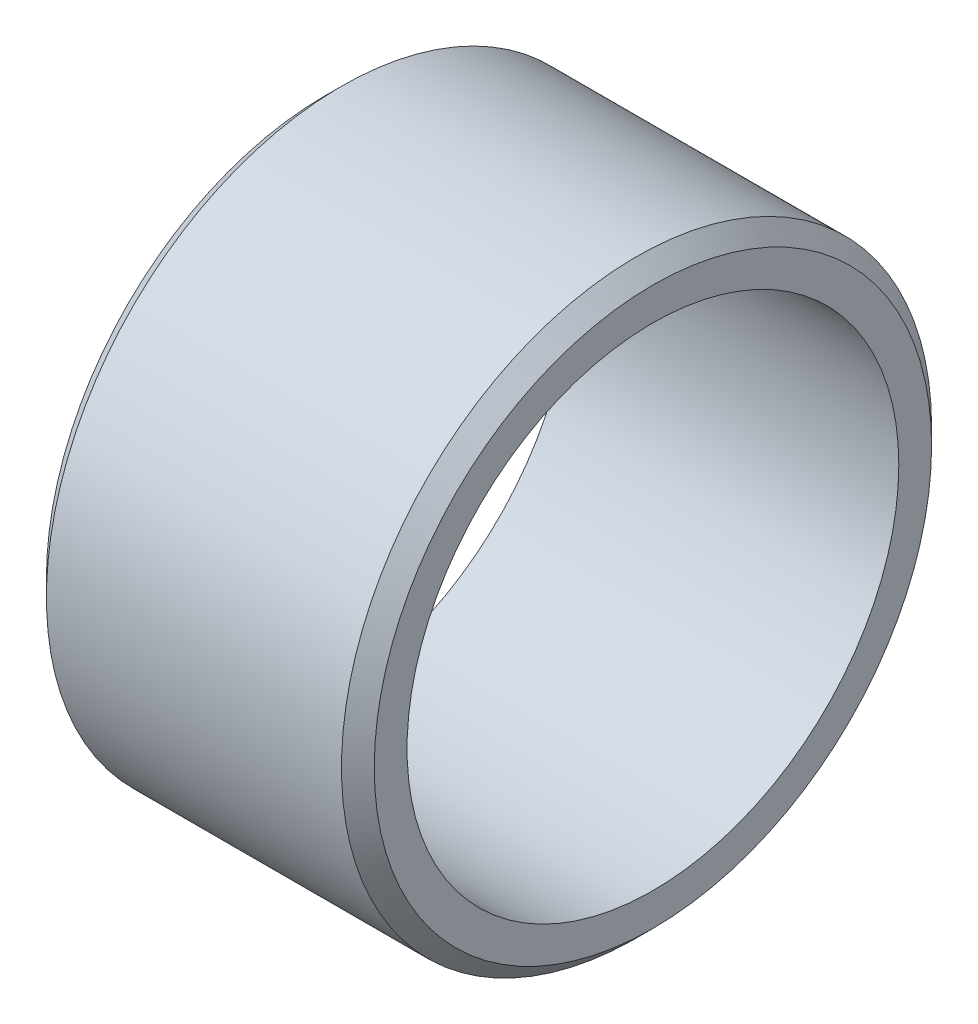
ISO-10303-21;
HEADER;
FILE_DESCRIPTION(('STEP AP214'),'2;1');
FILE_NAME('part.step','',(''),(''),'','','');
FILE_SCHEMA(('AUTOMOTIVE_DESIGN { 1 0 10303 214 1 1 1 1 }'));
ENDSEC;
DATA;
#1=APPLICATION_CONTEXT('core data for automotive mechanical design processes');
#2=APPLICATION_PROTOCOL_DEFINITION('international standard','automotive_design',2000,#1);
#3=PRODUCT_CONTEXT('',#1,'mechanical');
#4=PRODUCT('Part','Part','',(#3));
#5=PRODUCT_RELATED_PRODUCT_CATEGORY('part','',(#4));
#6=PRODUCT_DEFINITION_FORMATION('','',#4);
#7=PRODUCT_DEFINITION_CONTEXT('part definition',#1,'design');
#8=PRODUCT_DEFINITION('design','',#6,#7);
#9=PRODUCT_DEFINITION_SHAPE('','',#8);
#10=(LENGTH_UNIT() NAMED_UNIT(*) SI_UNIT(.MILLI.,.METRE.));
#11=(NAMED_UNIT(*) PLANE_ANGLE_UNIT() SI_UNIT($,.RADIAN.));
#12=(NAMED_UNIT(*) SI_UNIT($,.STERADIAN.) SOLID_ANGLE_UNIT());
#13=UNCERTAINTY_MEASURE_WITH_UNIT(LENGTH_MEASURE(1.E-05),#10,'distance_accuracy_value','');
#14=(GEOMETRIC_REPRESENTATION_CONTEXT(3) GLOBAL_UNCERTAINTY_ASSIGNED_CONTEXT((#13)) GLOBAL_UNIT_ASSIGNED_CONTEXT((#10,
#11,#12)) REPRESENTATION_CONTEXT('',''));
#15=CARTESIAN_POINT('',(0.,0.,0.));
#16=DIRECTION('',(0.,0.,1.));
#17=DIRECTION('',(1.,0.,0.));
#18=AXIS2_PLACEMENT_3D('',#15,#16,#17);
#19=CARTESIAN_POINT('',(0.5,0.,0.));
#20=DIRECTION('',(1.,0.,0.));
#21=DIRECTION('',(0.,0.,-1.));
#22=AXIS2_PLACEMENT_3D('',#19,#20,#21);
#23=CONICAL_SURFACE('',#22,9.,0.785398163397448);
#24=CARTESIAN_POINT('',(0.,0.,0.));
#25=DIRECTION('',(1.,0.,0.));
#26=DIRECTION('',(0.,0.,-1.));
#27=AXIS2_PLACEMENT_3D('',#24,#25,#26);
#28=CIRCLE('',#27,8.5);
#29=CARTESIAN_POINT('',(0.,0.,-8.5));
#30=VERTEX_POINT('',#29);
#31=EDGE_CURVE('E59',#30,#30,#28,.T.);
#32=ORIENTED_EDGE('',*,*,#31,.T.);
#33=EDGE_LOOP('',(#32));
#34=FACE_BOUND('',#33,.T.);
#35=CARTESIAN_POINT('',(0.5,0.,0.));
#36=DIRECTION('',(1.,0.,0.));
#37=DIRECTION('',(0.,0.,-1.));
#38=AXIS2_PLACEMENT_3D('',#35,#36,#37);
#39=CIRCLE('',#38,9.);
#40=CARTESIAN_POINT('',(0.5,0.,-9.));
#41=VERTEX_POINT('',#40);
#42=EDGE_CURVE('E10',#41,#41,#39,.T.);
#43=ORIENTED_EDGE('',*,*,#42,.F.);
#44=EDGE_LOOP('',(#43));
#45=FACE_BOUND('',#44,.T.);
#46=ADVANCED_FACE('F37',(#34,#45),#23,.T.);
#47=CARTESIAN_POINT('',(0.,0.,0.));
#48=DIRECTION('',(1.,0.,0.));
#49=DIRECTION('',(0.,0.,-1.));
#50=AXIS2_PLACEMENT_3D('',#47,#48,#49);
#51=CYLINDRICAL_SURFACE('',#50,9.);
#52=ORIENTED_EDGE('',*,*,#42,.T.);
#53=EDGE_LOOP('',(#52));
#54=FACE_BOUND('',#53,.T.);
#55=CARTESIAN_POINT('',(9.5,0.,0.));
#56=DIRECTION('',(1.,0.,0.));
#57=DIRECTION('',(0.,0.,-1.));
#58=AXIS2_PLACEMENT_3D('',#55,#56,#57);
#59=CIRCLE('',#58,9.);
#60=CARTESIAN_POINT('',(9.5,0.,-9.));
#61=VERTEX_POINT('',#60);
#62=EDGE_CURVE('E43',#61,#61,#59,.T.);
#63=ORIENTED_EDGE('',*,*,#62,.F.);
#64=EDGE_LOOP('',(#63));
#65=FACE_BOUND('',#64,.T.);
#66=ADVANCED_FACE('F77',(#54,#65),#51,.T.);
#67=CARTESIAN_POINT('',(10.,0.,0.));
#68=DIRECTION('',(-1.,0.,0.));
#69=DIRECTION('',(0.,0.,1.));
#70=AXIS2_PLACEMENT_3D('',#67,#68,#69);
#71=CONICAL_SURFACE('',#70,8.5,0.785398163397448);
#72=ORIENTED_EDGE('',*,*,#62,.T.);
#73=EDGE_LOOP('',(#72));
#74=FACE_BOUND('',#73,.T.);
#75=CARTESIAN_POINT('',(10.,0.,0.));
#76=DIRECTION('',(1.,0.,0.));
#77=DIRECTION('',(0.,0.,-1.));
#78=AXIS2_PLACEMENT_3D('',#75,#76,#77);
#79=CIRCLE('',#78,8.5);
#80=CARTESIAN_POINT('',(10.,0.,-8.5));
#81=VERTEX_POINT('',#80);
#82=EDGE_CURVE('E47',#81,#81,#79,.T.);
#83=ORIENTED_EDGE('',*,*,#82,.F.);
#84=EDGE_LOOP('',(#83));
#85=FACE_BOUND('',#84,.T.);
#86=ADVANCED_FACE('F81',(#74,#85),#71,.T.);
#87=CARTESIAN_POINT('',(10.,7.5,0.));
#88=DIRECTION('',(1.,0.,0.));
#89=DIRECTION('',(0.,0.,-1.));
#90=AXIS2_PLACEMENT_3D('',#87,#88,#89);
#91=PLANE('',#90);
#92=ORIENTED_EDGE('',*,*,#82,.T.);
#93=EDGE_LOOP('',(#92));
#94=FACE_BOUND('',#93,.T.);
#95=CARTESIAN_POINT('',(10.,0.,0.));
#96=DIRECTION('',(1.,0.,0.));
#97=DIRECTION('',(0.,0.,-1.));
#98=AXIS2_PLACEMENT_3D('',#95,#96,#97);
#99=CIRCLE('',#98,7.5);
#100=CARTESIAN_POINT('',(10.,0.,-7.5));
#101=VERTEX_POINT('',#100);
#102=EDGE_CURVE('E51',#101,#101,#99,.T.);
#103=ORIENTED_EDGE('',*,*,#102,.F.);
#104=EDGE_LOOP('',(#103));
#105=FACE_BOUND('',#104,.T.);
#106=ADVANCED_FACE('F73',(#94,#105),#91,.T.);
#107=CARTESIAN_POINT('',(0.,0.,0.));
#108=DIRECTION('',(1.,0.,0.));
#109=DIRECTION('',(0.,0.,-1.));
#110=AXIS2_PLACEMENT_3D('',#107,#108,#109);
#111=CYLINDRICAL_SURFACE('',#110,7.5);
#112=ORIENTED_EDGE('',*,*,#102,.T.);
#113=EDGE_LOOP('',(#112));
#114=FACE_BOUND('',#113,.T.);
#115=CARTESIAN_POINT('',(0.,0.,0.));
#116=DIRECTION('',(1.,0.,0.));
#117=DIRECTION('',(0.,0.,-1.));
#118=AXIS2_PLACEMENT_3D('',#115,#116,#117);
#119=CIRCLE('',#118,7.5);
#120=CARTESIAN_POINT('',(0.,0.,-7.5));
#121=VERTEX_POINT('',#120);
#122=EDGE_CURVE('E56',#121,#121,#119,.T.);
#123=ORIENTED_EDGE('',*,*,#122,.F.);
#124=EDGE_LOOP('',(#123));
#125=FACE_BOUND('',#124,.T.);
#126=ADVANCED_FACE('F67',(#114,#125),#111,.F.);
#127=CARTESIAN_POINT('',(0.,8.5,0.));
#128=DIRECTION('',(-1.,0.,0.));
#129=DIRECTION('',(0.,0.,1.));
#130=AXIS2_PLACEMENT_3D('',#127,#128,#129);
#131=PLANE('',#130);
#132=ORIENTED_EDGE('',*,*,#122,.T.);
#133=EDGE_LOOP('',(#132));
#134=FACE_BOUND('',#133,.T.);
#135=ORIENTED_EDGE('',*,*,#31,.F.);
#136=EDGE_LOOP('',(#135));
#137=FACE_BOUND('',#136,.T.);
#138=ADVANCED_FACE('F65',(#134,#137),#131,.T.);
#139=CLOSED_SHELL('',(#46,#66,#86,#106,#126,#138));
#140=MANIFOLD_SOLID_BREP('B2',#139);
#141=ADVANCED_BREP_SHAPE_REPRESENTATION('',(#18,#140),#14);
#142=SHAPE_DEFINITION_REPRESENTATION(#9,#141);
ENDSEC;
END-ISO-10303-21;
